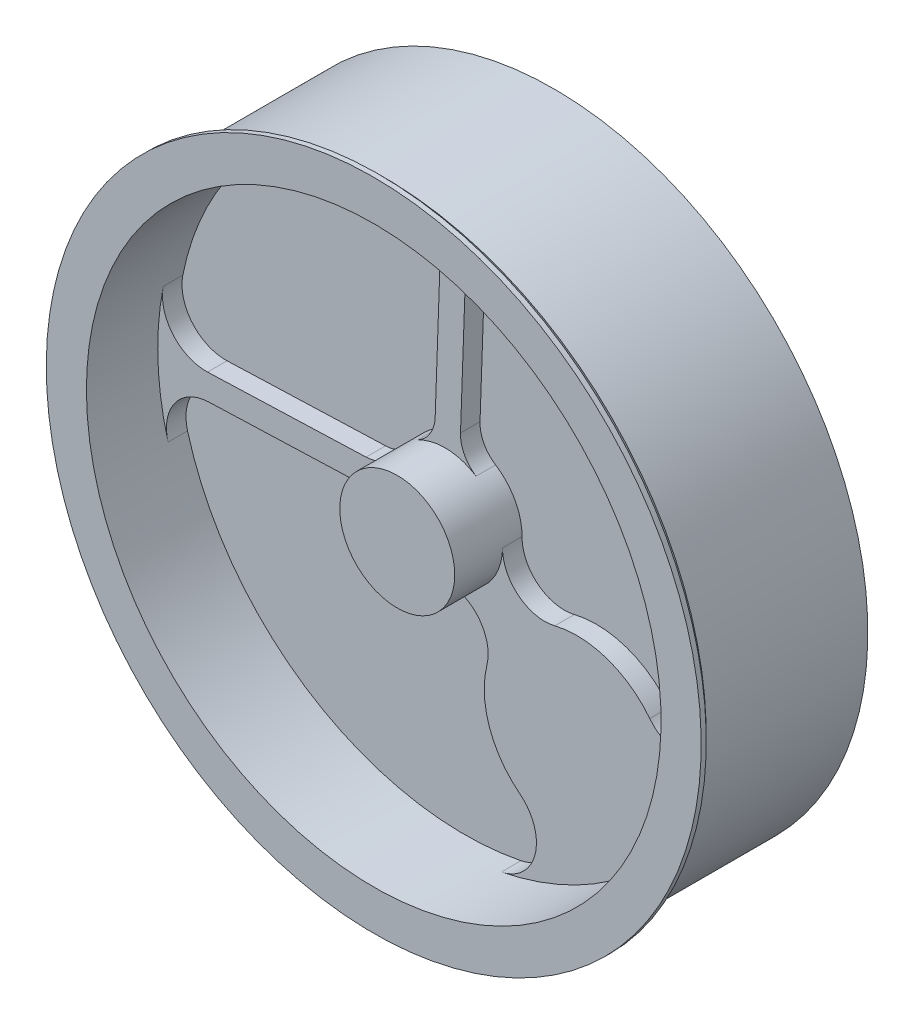
ISO-10303-21;
HEADER;
FILE_DESCRIPTION(('STEP AP214'),'2;1');
FILE_NAME('part.step','',(''),(''),'','','');
FILE_SCHEMA(('AUTOMOTIVE_DESIGN { 1 0 10303 214 1 1 1 1 }'));
ENDSEC;
DATA;
#1=APPLICATION_CONTEXT('core data for automotive mechanical design processes');
#2=APPLICATION_PROTOCOL_DEFINITION('international standard','automotive_design',2000,#1);
#3=PRODUCT_CONTEXT('',#1,'mechanical');
#4=PRODUCT('Part','Part','',(#3));
#5=PRODUCT_RELATED_PRODUCT_CATEGORY('part','',(#4));
#6=PRODUCT_DEFINITION_FORMATION('','',#4);
#7=PRODUCT_DEFINITION_CONTEXT('part definition',#1,'design');
#8=PRODUCT_DEFINITION('design','',#6,#7);
#9=PRODUCT_DEFINITION_SHAPE('','',#8);
#10=(LENGTH_UNIT() NAMED_UNIT(*) SI_UNIT(.MILLI.,.METRE.));
#11=(NAMED_UNIT(*) PLANE_ANGLE_UNIT() SI_UNIT($,.RADIAN.));
#12=(NAMED_UNIT(*) SI_UNIT($,.STERADIAN.) SOLID_ANGLE_UNIT());
#13=UNCERTAINTY_MEASURE_WITH_UNIT(LENGTH_MEASURE(1.E-05),#10,'distance_accuracy_value','');
#14=(GEOMETRIC_REPRESENTATION_CONTEXT(3) GLOBAL_UNCERTAINTY_ASSIGNED_CONTEXT((#13)) GLOBAL_UNIT_ASSIGNED_CONTEXT((#10,
#11,#12)) REPRESENTATION_CONTEXT('',''));
#15=CARTESIAN_POINT('',(0.,0.,0.));
#16=DIRECTION('',(0.,0.,1.));
#17=DIRECTION('',(1.,0.,0.));
#18=AXIS2_PLACEMENT_3D('',#15,#16,#17);
#19=CARTESIAN_POINT('',(-11.5492341504829,-7.39890846931906,17.1965997720002));
#20=DIRECTION('',(0.,0.,-1.));
#21=DIRECTION('',(0.707106781186549,-0.707106781186547,0.));
#22=AXIS2_PLACEMENT_3D('',#19,#20,#21);
#23=CYLINDRICAL_SURFACE('',#22,5.08);
#24=CARTESIAN_POINT('',(-11.5492341504829,-7.39890846931906,7.08025000000022));
#25=DIRECTION('',(0.,0.,1.));
#26=DIRECTION('',(0.707106781186549,-0.707106781186547,0.));
#27=AXIS2_PLACEMENT_3D('',#24,#25,#26);
#28=CIRCLE('',#27,5.08);
#29=CARTESIAN_POINT('',(-7.27174002067506,-4.65857199920099,7.08025000000022));
#30=VERTEX_POINT('',#29);
#31=CARTESIAN_POINT('',(-11.7292502806064,-2.32209901919241,7.08025000000022));
#32=VERTEX_POINT('',#31);
#33=EDGE_CURVE('E522',#30,#32,#28,.T.);
#34=ORIENTED_EDGE('',*,*,#33,.F.);
#35=DIRECTION('',(0.,0.,-1.));
#36=VECTOR('',#35,1.);
#37=CARTESIAN_POINT('',(-7.27174002067506,-4.65857199920099,17.1965997720002));
#38=LINE('',#37,#36);
#39=CARTESIAN_POINT('',(-7.27174002067506,-4.65857199920099,10.0125100000002));
#40=VERTEX_POINT('',#39);
#41=EDGE_CURVE('E386',#40,#30,#38,.T.);
#42=ORIENTED_EDGE('',*,*,#41,.F.);
#43=CARTESIAN_POINT('',(-11.5492341504829,-7.39890846931906,10.0125100000002));
#44=DIRECTION('',(0.,0.,-1.));
#45=DIRECTION('',(0.707106781186549,-0.707106781186547,0.));
#46=AXIS2_PLACEMENT_3D('',#43,#44,#45);
#47=CIRCLE('',#46,5.08);
#48=CARTESIAN_POINT('',(-11.7292502806064,-2.32209901919241,10.0125100000002));
#49=VERTEX_POINT('',#48);
#50=EDGE_CURVE('E250',#49,#40,#47,.T.);
#51=ORIENTED_EDGE('',*,*,#50,.F.);
#52=DIRECTION('',(0.,0.,1.));
#53=VECTOR('',#52,1.);
#54=CARTESIAN_POINT('',(-11.7292502806064,-2.32209901919241,10.0125100000002));
#55=LINE('',#54,#53);
#56=EDGE_CURVE('E546',#32,#49,#55,.T.);
#57=ORIENTED_EDGE('',*,*,#56,.F.);
#58=EDGE_LOOP('',(#34,#42,#51,#57));
#59=FACE_BOUND('',#58,.T.);
#60=ADVANCED_FACE('F17',(#59),#23,.F.);
#61=CARTESIAN_POINT('',(7.3989084693171,11.549234150481,17.1965997720002));
#62=DIRECTION('',(0.,0.,-1.));
#63=DIRECTION('',(0.707106781186549,-0.707106781186547,0.));
#64=AXIS2_PLACEMENT_3D('',#61,#62,#63);
#65=CYLINDRICAL_SURFACE('',#64,5.08);
#66=CARTESIAN_POINT('',(7.3989084693171,11.549234150481,7.08025000000022));
#67=DIRECTION('',(0.,0.,1.));
#68=DIRECTION('',(0.707106781186548,-0.707106781186548,0.));
#69=AXIS2_PLACEMENT_3D('',#66,#67,#68);
#70=CIRCLE('',#69,5.08);
#71=CARTESIAN_POINT('',(2.32209901919045,11.7292502806045,7.08025000000022));
#72=VERTEX_POINT('',#71);
#73=CARTESIAN_POINT('',(4.65857199919904,7.27174002067314,7.08025000000022));
#74=VERTEX_POINT('',#73);
#75=EDGE_CURVE('E505',#72,#74,#70,.T.);
#76=ORIENTED_EDGE('',*,*,#75,.F.);
#77=DIRECTION('',(0.,0.,-1.));
#78=VECTOR('',#77,1.);
#79=CARTESIAN_POINT('',(2.32209901919044,11.7292502806045,7.08025000000022));
#80=LINE('',#79,#78);
#81=CARTESIAN_POINT('',(2.32209901919045,11.7292502806045,10.0125100000002));
#82=VERTEX_POINT('',#81);
#83=EDGE_CURVE('E328',#82,#72,#80,.T.);
#84=ORIENTED_EDGE('',*,*,#83,.F.);
#85=CARTESIAN_POINT('',(7.3989084693171,11.549234150481,10.0125100000002));
#86=DIRECTION('',(0.,0.,-1.));
#87=DIRECTION('',(0.707106781186549,-0.707106781186547,0.));
#88=AXIS2_PLACEMENT_3D('',#85,#86,#87);
#89=CIRCLE('',#88,5.08);
#90=CARTESIAN_POINT('',(4.65857199919904,7.27174002067314,10.0125100000002));
#91=VERTEX_POINT('',#90);
#92=EDGE_CURVE('E397',#91,#82,#89,.T.);
#93=ORIENTED_EDGE('',*,*,#92,.F.);
#94=DIRECTION('',(0.,0.,1.));
#95=VECTOR('',#94,1.);
#96=CARTESIAN_POINT('',(4.65857199919904,7.27174002067314,17.1965997720002));
#97=LINE('',#96,#95);
#98=EDGE_CURVE('E425',#74,#91,#97,.T.);
#99=ORIENTED_EDGE('',*,*,#98,.F.);
#100=EDGE_LOOP('',(#76,#84,#93,#99));
#101=FACE_BOUND('',#100,.T.);
#102=ADVANCED_FACE('F851',(#101),#65,.F.);
#103=CARTESIAN_POINT('',(-8.48548533625716,1.60531448887507,-67.4343168572308));
#104=DIRECTION('',(0.0354362460873041,-0.999371939001311,0.));
#105=DIRECTION('',(0.999371939001311,0.0354362460873041,0.));
#106=AXIS2_PLACEMENT_3D('',#103,#104,#105);
#107=PLANE('',#106);
#108=DIRECTION('',(0.999371939001311,0.0354362460873041,0.));
#109=VECTOR('',#108,1.);
#110=CARTESIAN_POINT('',(-8.48548533625716,1.60531448887507,10.0125100000002));
#111=LINE('',#110,#109);
#112=CARTESIAN_POINT('',(-35.6890021533703,0.640718147162003,10.0125100000002));
#113=VERTEX_POINT('',#112);
#114=CARTESIAN_POINT('',(-11.8642623781991,1.48550806840259,10.0125100000002));
#115=VERTEX_POINT('',#114);
#116=EDGE_CURVE('E214',#113,#115,#111,.T.);
#117=ORIENTED_EDGE('',*,*,#116,.T.);
#118=DIRECTION('',(0.,0.,-1.));
#119=VECTOR('',#118,1.);
#120=CARTESIAN_POINT('',(-11.8642623781991,1.48550806840259,7.08025000000022));
#121=LINE('',#120,#119);
#122=CARTESIAN_POINT('',(-11.8642623781991,1.48550806840259,7.08025000000022));
#123=VERTEX_POINT('',#122);
#124=EDGE_CURVE('E362',#115,#123,#121,.T.);
#125=ORIENTED_EDGE('',*,*,#124,.T.);
#126=DIRECTION('',(0.999371939001311,0.0354362460873041,0.));
#127=VECTOR('',#126,1.);
#128=CARTESIAN_POINT('',(-8.48548533625716,1.60531448887507,7.08025000000022));
#129=LINE('',#128,#127);
#130=CARTESIAN_POINT('',(-35.6890021533703,0.640718147162003,7.08025000000022));
#131=VERTEX_POINT('',#130);
#132=EDGE_CURVE('E206',#131,#123,#129,.T.);
#133=ORIENTED_EDGE('',*,*,#132,.F.);
#134=DIRECTION('',(0.,0.,1.));
#135=VECTOR('',#134,1.);
#136=CARTESIAN_POINT('',(-35.6890021533703,0.640718147162003,-67.4343168572308));
#137=LINE('',#136,#135);
#138=EDGE_CURVE('E11',#131,#113,#137,.T.);
#139=ORIENTED_EDGE('',*,*,#138,.T.);
#140=EDGE_LOOP('',(#117,#125,#133,#139));
#141=FACE_BOUND('',#140,.T.);
#142=ADVANCED_FACE('F885',(#141),#107,.F.);
#143=CARTESIAN_POINT('',(-35.9210244842783,7.18420489685501,-67.4343168572308));
#144=DIRECTION('',(0.,0.,1.));
#145=DIRECTION('',(-0.707106781186549,0.707106781186547,0.));
#146=AXIS2_PLACEMENT_3D('',#143,#144,#145);
#147=CYLINDRICAL_SURFACE('',#146,6.54759904128587);
#148=DIRECTION('',(0.,0.,1.));
#149=VECTOR('',#148,1.);
#150=CARTESIAN_POINT('',(-42.3414735763357,8.46829471526647,-67.4343168572308));
#151=LINE('',#150,#149);
#152=CARTESIAN_POINT('',(-42.3414735763357,8.46829471526647,7.08025000000022));
#153=VERTEX_POINT('',#152);
#154=CARTESIAN_POINT('',(-42.3414735763357,8.46829471526647,10.0125100000002));
#155=VERTEX_POINT('',#154);
#156=EDGE_CURVE('E74',#153,#155,#151,.T.);
#157=ORIENTED_EDGE('',*,*,#156,.T.);
#158=CARTESIAN_POINT('',(-35.9210244842783,7.18420489685501,10.0125100000002));
#159=DIRECTION('',(0.,0.,1.));
#160=DIRECTION('',(-0.707106781186549,0.707106781186547,0.));
#161=AXIS2_PLACEMENT_3D('',#158,#159,#160);
#162=CIRCLE('',#161,6.54759904128587);
#163=EDGE_CURVE('E481',#155,#113,#162,.T.);
#164=ORIENTED_EDGE('',*,*,#163,.T.);
#165=ORIENTED_EDGE('',*,*,#138,.F.);
#166=CARTESIAN_POINT('',(-35.9210244842783,7.18420489685501,7.08025000000022));
#167=DIRECTION('',(0.,0.,1.));
#168=DIRECTION('',(0.707106781186551,-0.707106781186544,0.));
#169=AXIS2_PLACEMENT_3D('',#166,#167,#168);
#170=CIRCLE('',#169,6.54759904128587);
#171=EDGE_CURVE('E474',#153,#131,#170,.T.);
#172=ORIENTED_EDGE('',*,*,#171,.F.);
#173=EDGE_LOOP('',(#157,#164,#165,#172));
#174=FACE_BOUND('',#173,.T.);
#175=ADVANCED_FACE('F769',(#174),#147,.F.);
#176=CARTESIAN_POINT('',(-7.18420489685705,35.9210244842764,-67.4343168572308));
#177=DIRECTION('',(0.,0.,1.));
#178=DIRECTION('',(-0.707106781186549,0.707106781186547,0.));
#179=AXIS2_PLACEMENT_3D('',#176,#177,#178);
#180=CYLINDRICAL_SURFACE('',#179,6.54759904128587);
#181=DIRECTION('',(0.,0.,1.));
#182=VECTOR('',#181,1.);
#183=CARTESIAN_POINT('',(-0.640718147164029,35.6890021533683,-67.4343168572308));
#184=LINE('',#183,#182);
#185=CARTESIAN_POINT('',(-0.640718147164029,35.6890021533683,7.08025000000022));
#186=VERTEX_POINT('',#185);
#187=CARTESIAN_POINT('',(-0.640718147164029,35.6890021533683,10.0125100000002));
#188=VERTEX_POINT('',#187);
#189=EDGE_CURVE('E27',#186,#188,#184,.T.);
#190=ORIENTED_EDGE('',*,*,#189,.T.);
#191=CARTESIAN_POINT('',(-7.18420489685705,35.9210244842764,10.0125100000002));
#192=DIRECTION('',(0.,0.,1.));
#193=DIRECTION('',(-0.707106781186549,0.707106781186547,0.));
#194=AXIS2_PLACEMENT_3D('',#191,#192,#193);
#195=CIRCLE('',#194,6.54759904128587);
#196=CARTESIAN_POINT('',(-8.46829471526851,42.3414735763337,10.0125100000002));
#197=VERTEX_POINT('',#196);
#198=EDGE_CURVE('E453',#188,#197,#195,.T.);
#199=ORIENTED_EDGE('',*,*,#198,.T.);
#200=DIRECTION('',(0.,0.,1.));
#201=VECTOR('',#200,1.);
#202=CARTESIAN_POINT('',(-8.46829471526851,42.3414735763337,-67.4343168572308));
#203=LINE('',#202,#201);
#204=CARTESIAN_POINT('',(-8.46829471526851,42.3414735763337,7.08025000000022));
#205=VERTEX_POINT('',#204);
#206=EDGE_CURVE('E353',#205,#197,#203,.T.);
#207=ORIENTED_EDGE('',*,*,#206,.F.);
#208=CARTESIAN_POINT('',(-7.18420489685705,35.9210244842764,7.08025000000022));
#209=DIRECTION('',(0.,0.,1.));
#210=DIRECTION('',(0.707106781186549,-0.707106781186547,0.));
#211=AXIS2_PLACEMENT_3D('',#208,#209,#210);
#212=CIRCLE('',#211,6.54759904128587);
#213=EDGE_CURVE('E447',#186,#205,#212,.T.);
#214=ORIENTED_EDGE('',*,*,#213,.F.);
#215=EDGE_LOOP('',(#190,#199,#207,#214));
#216=FACE_BOUND('',#215,.T.);
#217=ADVANCED_FACE('F858',(#216),#180,.F.);
#218=CARTESIAN_POINT('',(-0.640718147164029,35.6890021533683,-67.4343168572308));
#219=DIRECTION('',(0.999371939001312,-0.0354362460873013,0.));
#220=DIRECTION('',(0.0354362460873013,0.999371939001312,0.));
#221=AXIS2_PLACEMENT_3D('',#218,#219,#220);
#222=PLANE('',#221);
#223=DIRECTION('',(0.0354362460873013,0.999371939001312,0.));
#224=VECTOR('',#223,1.);
#225=CARTESIAN_POINT('',(-0.640718147164029,35.6890021533683,7.08025000000022));
#226=LINE('',#225,#224);
#227=CARTESIAN_POINT('',(-1.48550806840454,11.8642623781971,7.08025000000022));
#228=VERTEX_POINT('',#227);
#229=EDGE_CURVE('E314',#228,#186,#226,.T.);
#230=ORIENTED_EDGE('',*,*,#229,.F.);
#231=DIRECTION('',(0.,0.,1.));
#232=VECTOR('',#231,1.);
#233=CARTESIAN_POINT('',(-1.48550806840454,11.8642623781971,10.0125100000002));
#234=LINE('',#233,#232);
#235=CARTESIAN_POINT('',(-1.48550806840454,11.8642623781971,10.0125100000002));
#236=VERTEX_POINT('',#235);
#237=EDGE_CURVE('E458',#228,#236,#234,.T.);
#238=ORIENTED_EDGE('',*,*,#237,.T.);
#239=DIRECTION('',(0.0354362460873013,0.999371939001312,0.));
#240=VECTOR('',#239,1.);
#241=CARTESIAN_POINT('',(-0.640718147164029,35.6890021533683,10.0125100000002));
#242=LINE('',#241,#240);
#243=EDGE_CURVE('E450',#236,#188,#242,.T.);
#244=ORIENTED_EDGE('',*,*,#243,.T.);
#245=ORIENTED_EDGE('',*,*,#189,.F.);
#246=EDGE_LOOP('',(#230,#238,#244,#245));
#247=FACE_BOUND('',#246,.T.);
#248=ADVANCED_FACE('F855',(#247),#222,.F.);
#249=CARTESIAN_POINT('',(-1.66533453693774E-12,-2.63677968348475E-13,7.08025000000022));
#250=DIRECTION('',(0.,0.,-1.));
#251=DIRECTION('',(0.453990499739542,0.891006524188371,0.));
#252=AXIS2_PLACEMENT_3D('',#249,#250,#251);
#253=PLANE('',#252);
#254=CARTESIAN_POINT('',(-1.66533453693774E-12,-2.63677968348475E-13,7.08025000000022));
#255=DIRECTION('',(0.,0.,-1.));
#256=DIRECTION('',(0.707106781186549,-0.707106781186547,0.));
#257=AXIS2_PLACEMENT_3D('',#254,#255,#256);
#258=CIRCLE('',#257,8.636);
#259=CARTESIAN_POINT('',(-7.58343461635186,4.1318295487035,7.08025000000022));
#260=VERTEX_POINT('',#259);
#261=CARTESIAN_POINT('',(-4.13182954870546,7.58343461634993,7.08025000000022));
#262=VERTEX_POINT('',#261);
#263=EDGE_CURVE('E340',#260,#262,#258,.T.);
#264=ORIENTED_EDGE('',*,*,#263,.T.);
#265=CARTESIAN_POINT('',(-6.56231751853122,12.0442785083206,7.08025000000022));
#266=DIRECTION('',(0.,0.,1.));
#267=DIRECTION('',(0.707106781186555,-0.70710678118654,0.));
#268=AXIS2_PLACEMENT_3D('',#265,#266,#267);
#269=CIRCLE('',#268,5.08);
#270=EDGE_CURVE('E361',#262,#228,#269,.T.);
#271=ORIENTED_EDGE('',*,*,#270,.T.);
#272=ORIENTED_EDGE('',*,*,#229,.T.);
#273=ORIENTED_EDGE('',*,*,#213,.T.);
#274=CARTESIAN_POINT('',(-1.66533453693774E-12,-2.63677968348475E-13,7.08025000000022));
#275=DIRECTION('',(0.,0.,1.));
#276=DIRECTION('',(0.707106781186548,-0.707106781186548,0.));
#277=AXIS2_PLACEMENT_3D('',#274,#275,#276);
#278=CIRCLE('',#277,43.18);
#279=EDGE_CURVE('E469',#205,#153,#278,.T.);
#280=ORIENTED_EDGE('',*,*,#279,.T.);
#281=ORIENTED_EDGE('',*,*,#171,.T.);
#282=ORIENTED_EDGE('',*,*,#132,.T.);
#283=CARTESIAN_POINT('',(-12.0442785083226,6.56231751852925,7.08025000000022));
#284=DIRECTION('',(0.,0.,1.));
#285=DIRECTION('',(0.707106781186547,-0.707106781186549,0.));
#286=AXIS2_PLACEMENT_3D('',#283,#284,#285);
#287=CIRCLE('',#286,5.08);
#288=EDGE_CURVE('E439',#123,#260,#287,.T.);
#289=ORIENTED_EDGE('',*,*,#288,.T.);
#290=EDGE_LOOP('',(#264,#271,#272,#273,#280,#281,#282,#289));
#291=FACE_BOUND('',#290,.T.);
#292=ADVANCED_FACE('F563',(#291),#253,.F.);
#293=CARTESIAN_POINT('',(35.921024484275,-7.18420489685553,-67.4343168572308));
#294=DIRECTION('',(0.,0.,1.));
#295=DIRECTION('',(-0.707106781186549,0.707106781186547,0.));
#296=AXIS2_PLACEMENT_3D('',#293,#294,#295);
#297=CYLINDRICAL_SURFACE('',#296,6.54759904128587);
#298=DIRECTION('',(0.,0.,1.));
#299=VECTOR('',#298,1.);
#300=CARTESIAN_POINT('',(30.7675471524146,-11.2231063063292,-67.4343168572308));
#301=LINE('',#300,#299);
#302=CARTESIAN_POINT('',(30.7675471524146,-11.2231063063292,7.08025000000022));
#303=VERTEX_POINT('',#302);
#304=CARTESIAN_POINT('',(30.7675471524146,-11.2231063063292,10.0125100000002));
#305=VERTEX_POINT('',#304);
#306=EDGE_CURVE('E310',#303,#305,#301,.T.);
#307=ORIENTED_EDGE('',*,*,#306,.T.);
#308=CARTESIAN_POINT('',(35.921024484275,-7.18420489685553,10.0125100000002));
#309=DIRECTION('',(0.,0.,1.));
#310=DIRECTION('',(0.707106781186549,-0.707106781186547,0.));
#311=AXIS2_PLACEMENT_3D('',#308,#309,#310);
#312=CIRCLE('',#311,6.54759904128587);
#313=CARTESIAN_POINT('',(42.3414735763323,-8.468294715267,10.0125100000002));
#314=VERTEX_POINT('',#313);
#315=EDGE_CURVE('E258',#305,#314,#312,.T.);
#316=ORIENTED_EDGE('',*,*,#315,.T.);
#317=DIRECTION('',(0.,0.,1.));
#318=VECTOR('',#317,1.);
#319=CARTESIAN_POINT('',(42.3414735763323,-8.468294715267,-67.4343168572308));
#320=LINE('',#319,#318);
#321=CARTESIAN_POINT('',(42.3414735763323,-8.468294715267,7.08025000000022));
#322=VERTEX_POINT('',#321);
#323=EDGE_CURVE('E232',#322,#314,#320,.T.);
#324=ORIENTED_EDGE('',*,*,#323,.F.);
#325=CARTESIAN_POINT('',(35.921024484275,-7.18420489685553,7.08025000000022));
#326=DIRECTION('',(0.,0.,1.));
#327=DIRECTION('',(0.707106781186549,-0.707106781186547,0.));
#328=AXIS2_PLACEMENT_3D('',#325,#326,#327);
#329=CIRCLE('',#328,6.54759904128587);
#330=EDGE_CURVE('E306',#303,#322,#329,.T.);
#331=ORIENTED_EDGE('',*,*,#330,.F.);
#332=EDGE_LOOP('',(#307,#316,#324,#331));
#333=FACE_BOUND('',#332,.T.);
#334=ADVANCED_FACE('F865',(#333),#297,.F.);
#335=CARTESIAN_POINT('',(19.8104450030769,-19.8104450030788,-67.4343168572308));
#336=DIRECTION('',(0.,0.,1.));
#337=DIRECTION('',(-0.707106781186549,0.707106781186547,0.));
#338=AXIS2_PLACEMENT_3D('',#335,#336,#337);
#339=CYLINDRICAL_SURFACE('',#338,13.921223847195);
#340=DIRECTION('',(0.,0.,1.));
#341=VECTOR('',#340,1.);
#342=CARTESIAN_POINT('',(16.4969267460492,-6.28931079902417,-67.4343168572308));
#343=LINE('',#342,#341);
#344=CARTESIAN_POINT('',(16.4969267460492,-6.28931079902417,7.08025000000022));
#345=VERTEX_POINT('',#344);
#346=CARTESIAN_POINT('',(16.4969267460492,-6.28931079902417,10.0125100000002));
#347=VERTEX_POINT('',#346);
#348=EDGE_CURVE('E315',#345,#347,#343,.T.);
#349=ORIENTED_EDGE('',*,*,#348,.T.);
#350=CARTESIAN_POINT('',(19.8104450030769,-19.8104450030788,10.0125100000002));
#351=DIRECTION('',(0.,0.,-1.));
#352=DIRECTION('',(-0.707106781186549,0.707106781186547,0.));
#353=AXIS2_PLACEMENT_3D('',#350,#351,#352);
#354=CIRCLE('',#353,13.921223847195);
#355=EDGE_CURVE('E295',#347,#305,#354,.T.);
#356=ORIENTED_EDGE('',*,*,#355,.T.);
#357=ORIENTED_EDGE('',*,*,#306,.F.);
#358=CARTESIAN_POINT('',(19.8104450030769,-19.8104450030788,7.08025000000022));
#359=DIRECTION('',(0.,0.,-1.));
#360=DIRECTION('',(0.707106781186549,-0.707106781186547,0.));
#361=AXIS2_PLACEMENT_3D('',#358,#359,#360);
#362=CIRCLE('',#361,13.921223847195);
#363=EDGE_CURVE('E303',#345,#303,#362,.T.);
#364=ORIENTED_EDGE('',*,*,#363,.F.);
#365=EDGE_LOOP('',(#349,#356,#357,#364));
#366=FACE_BOUND('',#365,.T.);
#367=ADVANCED_FACE('F868',(#366),#339,.T.);
#368=CARTESIAN_POINT('',(14.9855049656742,-0.121806911566297,-67.4343168572308));
#369=DIRECTION('',(0.,0.,1.));
#370=DIRECTION('',(-0.707106781186549,0.707106781186547,0.));
#371=AXIS2_PLACEMENT_3D('',#368,#369,#370);
#372=CYLINDRICAL_SURFACE('',#371,6.35);
#373=DIRECTION('',(0.,0.,1.));
#374=VECTOR('',#373,1.);
#375=CARTESIAN_POINT('',(8.63571472598101,-0.0701938134450852,-67.4343168572308));
#376=LINE('',#375,#374);
#377=CARTESIAN_POINT('',(8.63571472598101,-0.0701938134450852,7.08025000000022));
#378=VERTEX_POINT('',#377);
#379=CARTESIAN_POINT('',(8.63571472598101,-0.0701938134450852,10.0125100000002));
#380=VERTEX_POINT('',#379);
#381=EDGE_CURVE('E426',#378,#380,#376,.T.);
#382=ORIENTED_EDGE('',*,*,#381,.T.);
#383=CARTESIAN_POINT('',(14.9855049656742,-0.121806911566297,10.0125100000002));
#384=DIRECTION('',(0.,0.,1.));
#385=DIRECTION('',(0.707106781186549,-0.707106781186547,0.));
#386=AXIS2_PLACEMENT_3D('',#383,#384,#385);
#387=CIRCLE('',#386,6.35);
#388=EDGE_CURVE('E300',#380,#347,#387,.T.);
#389=ORIENTED_EDGE('',*,*,#388,.T.);
#390=ORIENTED_EDGE('',*,*,#348,.F.);
#391=CARTESIAN_POINT('',(14.9855049656742,-0.121806911566297,7.08025000000022));
#392=DIRECTION('',(0.,0.,1.));
#393=DIRECTION('',(0.707106781186549,-0.707106781186546,0.));
#394=AXIS2_PLACEMENT_3D('',#391,#392,#393);
#395=CIRCLE('',#394,6.35);
#396=EDGE_CURVE('E307',#378,#345,#395,.T.);
#397=ORIENTED_EDGE('',*,*,#396,.F.);
#398=EDGE_LOOP('',(#382,#389,#390,#397));
#399=FACE_BOUND('',#398,.T.);
#400=ADVANCED_FACE('F841',(#399),#372,.F.);
#401=CARTESIAN_POINT('',(3.16688894043096,35.5539900557758,-67.4343168572308));
#402=DIRECTION('',(-0.999371939001311,0.035436246087302,0.));
#403=DIRECTION('',(-0.035436246087302,-0.999371939001311,0.));
#404=AXIS2_PLACEMENT_3D('',#401,#402,#403);
#405=PLANE('',#404);
#406=DIRECTION('',(-0.035436246087302,-0.999371939001311,0.));
#407=VECTOR('',#406,1.);
#408=CARTESIAN_POINT('',(3.16688894043096,35.5539900557758,10.0125100000002));
#409=LINE('',#408,#407);
#410=CARTESIAN_POINT('',(3.16688894043096,35.5539900557758,10.0125100000002));
#411=VERTEX_POINT('',#410);
#412=EDGE_CURVE('E464',#411,#82,#409,.T.);
#413=ORIENTED_EDGE('',*,*,#412,.T.);
#414=ORIENTED_EDGE('',*,*,#83,.T.);
#415=DIRECTION('',(-0.035436246087302,-0.999371939001311,0.));
#416=VECTOR('',#415,1.);
#417=CARTESIAN_POINT('',(3.16688894043096,35.5539900557758,7.08025000000022));
#418=LINE('',#417,#416);
#419=CARTESIAN_POINT('',(3.16688894043096,35.5539900557758,7.08025000000022));
#420=VERTEX_POINT('',#419);
#421=EDGE_CURVE('E508',#420,#72,#418,.T.);
#422=ORIENTED_EDGE('',*,*,#421,.F.);
#423=DIRECTION('',(0.,0.,1.));
#424=VECTOR('',#423,1.);
#425=CARTESIAN_POINT('',(3.16688894043096,35.5539900557758,-67.4343168572308));
#426=LINE('',#425,#424);
#427=EDGE_CURVE('E347',#420,#411,#426,.T.);
#428=ORIENTED_EDGE('',*,*,#427,.T.);
#429=EDGE_LOOP('',(#413,#414,#422,#428));
#430=FACE_BOUND('',#429,.T.);
#431=ADVANCED_FACE('F876',(#430),#405,.F.);
#432=ORIENTED_EDGE('',*,*,#421,.T.);
#433=ORIENTED_EDGE('',*,*,#75,.T.);
#434=EDGE_CURVE('E420',#74,#378,#258,.T.);
#435=ORIENTED_EDGE('',*,*,#434,.T.);
#436=ORIENTED_EDGE('',*,*,#396,.T.);
#437=ORIENTED_EDGE('',*,*,#363,.T.);
#438=ORIENTED_EDGE('',*,*,#330,.T.);
#439=CARTESIAN_POINT('',(-1.66533453693774E-12,-2.63677968348475E-13,7.08025000000022));
#440=DIRECTION('',(0.,0.,1.));
#441=DIRECTION('',(0.707106781186549,-0.707106781186547,0.));
#442=AXIS2_PLACEMENT_3D('',#439,#440,#441);
#443=CIRCLE('',#442,43.18);
#444=CARTESIAN_POINT('',(11.4459880140568,41.6353426595965,7.08025000000022));
#445=VERTEX_POINT('',#444);
#446=EDGE_CURVE('E323',#322,#445,#443,.T.);
#447=ORIENTED_EDGE('',*,*,#446,.T.);
#448=CARTESIAN_POINT('',(9.71037569012394,35.3219677248678,7.08025000000022));
#449=DIRECTION('',(0.,0.,1.));
#450=DIRECTION('',(0.70710678118655,-0.707106781186545,0.));
#451=AXIS2_PLACEMENT_3D('',#448,#449,#450);
#452=CIRCLE('',#451,6.54759904128587);
#453=EDGE_CURVE('E348',#445,#420,#452,.T.);
#454=ORIENTED_EDGE('',*,*,#453,.T.);
#455=EDGE_LOOP('',(#432,#433,#435,#436,#437,#438,#447,#454));
#456=FACE_BOUND('',#455,.T.);
#457=ADVANCED_FACE('F846',(#456),#253,.F.);
#458=CARTESIAN_POINT('',(-8.35047323866453,-2.20229259871993,-67.4343168572308));
#459=DIRECTION('',(-0.0354362460873041,0.999371939001311,0.));
#460=DIRECTION('',(-0.999371939001311,-0.0354362460873041,0.));
#461=AXIS2_PLACEMENT_3D('',#458,#459,#460);
#462=PLANE('',#461);
#463=DIRECTION('',(-0.999371939001311,-0.0354362460873041,0.));
#464=VECTOR('',#463,1.);
#465=CARTESIAN_POINT('',(-8.35047323866453,-2.20229259871993,7.08025000000022));
#466=LINE('',#465,#464);
#467=CARTESIAN_POINT('',(-35.5539900557777,-3.16688894043299,7.08025000000022));
#468=VERTEX_POINT('',#467);
#469=EDGE_CURVE('E279',#32,#468,#466,.T.);
#470=ORIENTED_EDGE('',*,*,#469,.F.);
#471=ORIENTED_EDGE('',*,*,#56,.T.);
#472=DIRECTION('',(-0.999371939001311,-0.0354362460873041,0.));
#473=VECTOR('',#472,1.);
#474=CARTESIAN_POINT('',(-8.35047323866453,-2.20229259871993,10.0125100000002));
#475=LINE('',#474,#473);
#476=CARTESIAN_POINT('',(-35.5539900557777,-3.16688894043299,10.0125100000002));
#477=VERTEX_POINT('',#476);
#478=EDGE_CURVE('E543',#49,#477,#475,.T.);
#479=ORIENTED_EDGE('',*,*,#478,.T.);
#480=DIRECTION('',(0.,0.,1.));
#481=VECTOR('',#480,1.);
#482=CARTESIAN_POINT('',(-35.5539900557777,-3.16688894043299,-67.4343168572308));
#483=LINE('',#482,#481);
#484=EDGE_CURVE('E549',#468,#477,#483,.T.);
#485=ORIENTED_EDGE('',*,*,#484,.F.);
#486=EDGE_LOOP('',(#470,#471,#479,#485));
#487=FACE_BOUND('',#486,.T.);
#488=ADVANCED_FACE('F803',(#487),#462,.F.);
#489=CARTESIAN_POINT('',(0.121806911564409,-14.9855049656761,-67.4343168572308));
#490=DIRECTION('',(0.,0.,1.));
#491=DIRECTION('',(-0.707106781186549,0.707106781186547,0.));
#492=AXIS2_PLACEMENT_3D('',#489,#490,#491);
#493=CYLINDRICAL_SURFACE('',#492,6.35);
#494=DIRECTION('',(0.,0.,1.));
#495=VECTOR('',#494,1.);
#496=CARTESIAN_POINT('',(6.28931079902229,-16.496926746051,-67.4343168572308));
#497=LINE('',#496,#495);
#498=CARTESIAN_POINT('',(6.28931079902229,-16.496926746051,7.08025000000022));
#499=VERTEX_POINT('',#498);
#500=CARTESIAN_POINT('',(6.28931079902229,-16.496926746051,10.0125100000002));
#501=VERTEX_POINT('',#500);
#502=EDGE_CURVE('E285',#499,#501,#497,.T.);
#503=ORIENTED_EDGE('',*,*,#502,.T.);
#504=CARTESIAN_POINT('',(0.121806911564409,-14.9855049656761,10.0125100000002));
#505=DIRECTION('',(0.,0.,1.));
#506=DIRECTION('',(-0.707106781186549,0.707106781186547,0.));
#507=AXIS2_PLACEMENT_3D('',#504,#505,#506);
#508=CIRCLE('',#507,6.35);
#509=CARTESIAN_POINT('',(0.070193813443184,-8.63571472598294,10.0125100000002));
#510=VERTEX_POINT('',#509);
#511=EDGE_CURVE('E269',#501,#510,#508,.T.);
#512=ORIENTED_EDGE('',*,*,#511,.T.);
#513=DIRECTION('',(0.,0.,1.));
#514=VECTOR('',#513,1.);
#515=CARTESIAN_POINT('',(0.070193813443184,-8.63571472598294,-67.4343168572308));
#516=LINE('',#515,#514);
#517=CARTESIAN_POINT('',(0.070193813443184,-8.63571472598294,7.08025000000022));
#518=VERTEX_POINT('',#517);
#519=EDGE_CURVE('E412',#518,#510,#516,.T.);
#520=ORIENTED_EDGE('',*,*,#519,.F.);
#521=CARTESIAN_POINT('',(0.121806911564409,-14.9855049656761,7.08025000000022));
#522=DIRECTION('',(0.,0.,1.));
#523=DIRECTION('',(0.707106781186549,-0.707106781186547,0.));
#524=AXIS2_PLACEMENT_3D('',#521,#522,#523);
#525=CIRCLE('',#524,6.35);
#526=EDGE_CURVE('E286',#499,#518,#525,.T.);
#527=ORIENTED_EDGE('',*,*,#526,.F.);
#528=EDGE_LOOP('',(#503,#512,#520,#527));
#529=FACE_BOUND('',#528,.T.);
#530=ADVANCED_FACE('F834',(#529),#493,.F.);
#531=DIRECTION('',(0.,0.,1.));
#532=VECTOR('',#531,1.);
#533=CARTESIAN_POINT('',(11.2231063063274,-30.7675471524165,-67.4343168572308));
#534=LINE('',#533,#532);
#535=CARTESIAN_POINT('',(11.2231063063274,-30.7675471524165,7.08025000000022));
#536=VERTEX_POINT('',#535);
#537=CARTESIAN_POINT('',(11.2231063063274,-30.7675471524165,10.0125100000002));
#538=VERTEX_POINT('',#537);
#539=EDGE_CURVE('E282',#536,#538,#534,.T.);
#540=ORIENTED_EDGE('',*,*,#539,.T.);
#541=EDGE_CURVE('E256',#538,#501,#354,.T.);
#542=ORIENTED_EDGE('',*,*,#541,.T.);
#543=ORIENTED_EDGE('',*,*,#502,.F.);
#544=EDGE_CURVE('E278',#536,#499,#362,.T.);
#545=ORIENTED_EDGE('',*,*,#544,.F.);
#546=EDGE_LOOP('',(#540,#542,#543,#545));
#547=FACE_BOUND('',#546,.T.);
#548=ADVANCED_FACE('F871',(#547),#339,.T.);
#549=CARTESIAN_POINT('',(7.18420489685371,-35.9210244842769,-67.4343168572308));
#550=DIRECTION('',(0.,0.,1.));
#551=DIRECTION('',(-0.707106781186549,0.707106781186547,0.));
#552=AXIS2_PLACEMENT_3D('',#549,#550,#551);
#553=CYLINDRICAL_SURFACE('',#552,6.54759904128587);
#554=DIRECTION('',(0.,0.,1.));
#555=VECTOR('',#554,1.);
#556=CARTESIAN_POINT('',(8.46829471526518,-42.3414735763342,-67.4343168572308));
#557=LINE('',#556,#555);
#558=CARTESIAN_POINT('',(8.46829471526518,-42.3414735763342,7.08025000000022));
#559=VERTEX_POINT('',#558);
#560=CARTESIAN_POINT('',(8.46829471526518,-42.3414735763342,10.0125100000002));
#561=VERTEX_POINT('',#560);
#562=EDGE_CURVE('E229',#559,#561,#557,.T.);
#563=ORIENTED_EDGE('',*,*,#562,.T.);
#564=CARTESIAN_POINT('',(7.18420489685371,-35.9210244842769,10.0125100000002));
#565=DIRECTION('',(0.,0.,1.));
#566=DIRECTION('',(-0.707106781186549,0.707106781186547,0.));
#567=AXIS2_PLACEMENT_3D('',#564,#565,#566);
#568=CIRCLE('',#567,6.54759904128587);
#569=EDGE_CURVE('E243',#561,#538,#568,.T.);
#570=ORIENTED_EDGE('',*,*,#569,.T.);
#571=ORIENTED_EDGE('',*,*,#539,.F.);
#572=CARTESIAN_POINT('',(7.18420489685371,-35.9210244842769,7.08025000000022));
#573=DIRECTION('',(0.,0.,1.));
#574=DIRECTION('',(0.707106781186549,-0.707106781186547,0.));
#575=AXIS2_PLACEMENT_3D('',#572,#573,#574);
#576=CIRCLE('',#575,6.54759904128587);
#577=EDGE_CURVE('E246',#559,#536,#576,.T.);
#578=ORIENTED_EDGE('',*,*,#577,.F.);
#579=EDGE_LOOP('',(#563,#570,#571,#578));
#580=FACE_BOUND('',#579,.T.);
#581=ADVANCED_FACE('F242',(#580),#553,.F.);
#582=EDGE_CURVE('E408',#518,#30,#258,.T.);
#583=ORIENTED_EDGE('',*,*,#582,.T.);
#584=ORIENTED_EDGE('',*,*,#33,.T.);
#585=ORIENTED_EDGE('',*,*,#469,.T.);
#586=CARTESIAN_POINT('',(-35.3219677248697,-9.71037569012596,7.08025000000022));
#587=DIRECTION('',(0.,0.,1.));
#588=DIRECTION('',(0.707106781186551,-0.707106781186545,0.));
#589=AXIS2_PLACEMENT_3D('',#586,#587,#588);
#590=CIRCLE('',#589,6.54759904128587);
#591=CARTESIAN_POINT('',(-41.6353426595983,-11.4459880140588,7.08025000000022));
#592=VERTEX_POINT('',#591);
#593=EDGE_CURVE('E378',#468,#592,#590,.T.);
#594=ORIENTED_EDGE('',*,*,#593,.T.);
#595=CARTESIAN_POINT('',(-1.66533453693774E-12,-2.63677968348475E-13,7.08025000000022));
#596=DIRECTION('',(0.,0.,1.));
#597=DIRECTION('',(0.70710678118655,-0.707106781186546,0.));
#598=AXIS2_PLACEMENT_3D('',#595,#596,#597);
#599=CIRCLE('',#598,43.18);
#600=EDGE_CURVE('E249',#592,#559,#599,.T.);
#601=ORIENTED_EDGE('',*,*,#600,.T.);
#602=ORIENTED_EDGE('',*,*,#577,.T.);
#603=ORIENTED_EDGE('',*,*,#544,.T.);
#604=ORIENTED_EDGE('',*,*,#526,.T.);
#605=EDGE_LOOP('',(#583,#584,#585,#594,#601,#602,#603,#604));
#606=FACE_BOUND('',#605,.T.);
#607=ADVANCED_FACE('F800',(#606),#253,.F.);
#608=CARTESIAN_POINT('',(-1.66533453693774E-12,-2.63677968348475E-13,17.1965997720002));
#609=DIRECTION('',(0.,0.,1.));
#610=DIRECTION('',(-0.707106781186549,0.707106781186547,0.));
#611=AXIS2_PLACEMENT_3D('',#608,#609,#610);
#612=PLANE('',#611);
#613=CARTESIAN_POINT('',(-1.66533453693774E-12,-2.63677968348475E-13,17.1965997720002));
#614=DIRECTION('',(0.,0.,1.));
#615=DIRECTION('',(-0.707106781186549,0.707106781186547,0.));
#616=AXIS2_PLACEMENT_3D('',#613,#614,#615);
#617=CIRCLE('',#616,8.636);
#618=CARTESIAN_POINT('',(-6.1065741623287,6.10657416232676,17.1965997720002));
#619=VERTEX_POINT('',#618);
#620=EDGE_CURVE('E404',#619,#619,#617,.T.);
#621=ORIENTED_EDGE('',*,*,#620,.T.);
#622=EDGE_LOOP('',(#621));
#623=FACE_BOUND('',#622,.T.);
#624=ADVANCED_FACE('F1002',(#623),#612,.T.);
#625=CARTESIAN_POINT('',(-1.66533453693774E-12,-2.63677968348475E-13,10.0125100000002));
#626=DIRECTION('',(0.,0.,-1.));
#627=DIRECTION('',(0.453990499739542,0.891006524188371,0.));
#628=AXIS2_PLACEMENT_3D('',#625,#626,#627);
#629=PLANE('',#628);
#630=ORIENTED_EDGE('',*,*,#116,.F.);
#631=ORIENTED_EDGE('',*,*,#163,.F.);
#632=CARTESIAN_POINT('',(-1.66533453693774E-12,-2.63677968348475E-13,10.0125100000002));
#633=DIRECTION('',(0.,0.,1.));
#634=DIRECTION('',(0.707106781186546,-0.707106781186549,0.));
#635=AXIS2_PLACEMENT_3D('',#632,#633,#634);
#636=CIRCLE('',#635,43.18);
#637=CARTESIAN_POINT('',(-41.6353426595983,-11.4459880140588,10.0125100000002));
#638=VERTEX_POINT('',#637);
#639=EDGE_CURVE('E484',#155,#638,#636,.T.);
#640=ORIENTED_EDGE('',*,*,#639,.T.);
#641=CARTESIAN_POINT('',(-35.3219677248697,-9.71037569012596,10.0125100000002));
#642=DIRECTION('',(0.,0.,1.));
#643=DIRECTION('',(-0.707106781186549,0.707106781186547,0.));
#644=AXIS2_PLACEMENT_3D('',#641,#642,#643);
#645=CIRCLE('',#644,6.54759904128587);
#646=EDGE_CURVE('E373',#477,#638,#645,.T.);
#647=ORIENTED_EDGE('',*,*,#646,.F.);
#648=ORIENTED_EDGE('',*,*,#478,.F.);
#649=ORIENTED_EDGE('',*,*,#50,.T.);
#650=CARTESIAN_POINT('',(-1.66533453693774E-12,-2.63677968348475E-13,10.0125100000002));
#651=DIRECTION('',(0.,0.,1.));
#652=DIRECTION('',(0.707106781186549,-0.707106781186547,0.));
#653=AXIS2_PLACEMENT_3D('',#650,#651,#652);
#654=CIRCLE('',#653,8.636);
#655=CARTESIAN_POINT('',(-7.58343461635186,4.1318295487035,10.0125100000002));
#656=VERTEX_POINT('',#655);
#657=EDGE_CURVE('E381',#656,#40,#654,.T.);
#658=ORIENTED_EDGE('',*,*,#657,.F.);
#659=CARTESIAN_POINT('',(-12.0442785083226,6.56231751852925,10.0125100000002));
#660=DIRECTION('',(0.,0.,-1.));
#661=DIRECTION('',(0.707106781186549,-0.707106781186547,0.));
#662=AXIS2_PLACEMENT_3D('',#659,#660,#661);
#663=CIRCLE('',#662,5.08);
#664=EDGE_CURVE('E388',#656,#115,#663,.T.);
#665=ORIENTED_EDGE('',*,*,#664,.T.);
#666=EDGE_LOOP('',(#630,#631,#640,#647,#648,#649,#658,#665));
#667=FACE_BOUND('',#666,.T.);
#668=ADVANCED_FACE('F773',(#667),#629,.F.);
#669=CARTESIAN_POINT('',(-34.2596771018804,-34.2596771018791,19.208));
#670=DIRECTION('',(0.,0.,-1.));
#671=DIRECTION('',(0.707106781186549,-0.707106781186547,0.));
#672=AXIS2_PLACEMENT_3D('',#669,#670,#671);
#673=PLANE('',#672);
#674=CARTESIAN_POINT('',(-1.66533453693774E-12,-2.63677968348475E-13,19.208));
#675=DIRECTION('',(0.,0.,-1.));
#676=DIRECTION('',(0.707106781186549,-0.707106781186547,0.));
#677=AXIS2_PLACEMENT_3D('',#674,#675,#676);
#678=CIRCLE('',#677,48.4505);
#679=CARTESIAN_POINT('',(34.2596771018772,-34.2596771018791,19.208));
#680=VERTEX_POINT('',#679);
#681=EDGE_CURVE('E322',#680,#680,#678,.T.);
#682=ORIENTED_EDGE('',*,*,#681,.T.);
#683=EDGE_LOOP('',(#682));
#684=FACE_BOUND('',#683,.T.);
#685=CARTESIAN_POINT('',(-1.66533453693774E-12,-2.63677968348475E-13,19.208));
#686=DIRECTION('',(0.,0.,-1.));
#687=DIRECTION('',(0.707106781186549,-0.707106781186547,0.));
#688=AXIS2_PLACEMENT_3D('',#685,#686,#687);
#689=CIRCLE('',#688,47.175);
#690=CARTESIAN_POINT('',(33.3577624024738,-33.3577624024756,19.208));
#691=VERTEX_POINT('',#690);
#692=EDGE_CURVE('E21',#691,#691,#689,.T.);
#693=ORIENTED_EDGE('',*,*,#692,.F.);
#694=EDGE_LOOP('',(#693));
#695=FACE_BOUND('',#694,.T.);
#696=ADVANCED_FACE('F1019',(#684,#695),#673,.T.);
#697=CARTESIAN_POINT('',(-1.66533453693774E-12,-2.63677968348475E-13,20.732));
#698=DIRECTION('',(0.,0.,1.));
#699=DIRECTION('',(-0.707106781186549,0.707106781186547,0.));
#700=AXIS2_PLACEMENT_3D('',#697,#698,#699);
#701=PLANE('',#700);
#702=CARTESIAN_POINT('',(-1.66533453693774E-12,-2.63677968348475E-13,20.732));
#703=DIRECTION('',(0.,0.,-1.));
#704=DIRECTION('',(0.707106781186549,-0.707106781186547,0.));
#705=AXIS2_PLACEMENT_3D('',#702,#703,#704);
#706=CIRCLE('',#705,49.2125);
#707=CARTESIAN_POINT('',(34.7984924691414,-34.7984924691432,20.732));
#708=VERTEX_POINT('',#707);
#709=EDGE_CURVE('E365',#708,#708,#706,.T.);
#710=ORIENTED_EDGE('',*,*,#709,.F.);
#711=EDGE_LOOP('',(#710));
#712=FACE_BOUND('',#711,.T.);
#713=CARTESIAN_POINT('',(-1.66533453693774E-12,-2.63677968348475E-13,20.732));
#714=DIRECTION('',(0.,0.,1.));
#715=DIRECTION('',(-0.707106781186549,0.707106781186547,0.));
#716=AXIS2_PLACEMENT_3D('',#713,#714,#715);
#717=CIRCLE('',#716,43.18);
#718=CARTESIAN_POINT('',(-30.5328708116369,30.5328708116348,20.732));
#719=VERTEX_POINT('',#718);
#720=EDGE_CURVE('E237',#719,#719,#717,.T.);
#721=ORIENTED_EDGE('',*,*,#720,.F.);
#722=EDGE_LOOP('',(#721));
#723=FACE_BOUND('',#722,.T.);
#724=ADVANCED_FACE('F1028',(#712,#723),#701,.T.);
#725=CARTESIAN_POINT('',(-4.13182954870546,7.58343461634993,10.0125100000002));
#726=VERTEX_POINT('',#725);
#727=EDGE_CURVE('E266',#91,#726,#654,.T.);
#728=ORIENTED_EDGE('',*,*,#727,.F.);
#729=ORIENTED_EDGE('',*,*,#92,.T.);
#730=ORIENTED_EDGE('',*,*,#412,.F.);
#731=CARTESIAN_POINT('',(9.71037569012394,35.3219677248678,10.0125100000002));
#732=DIRECTION('',(0.,0.,1.));
#733=DIRECTION('',(0.707106781186549,-0.707106781186547,0.));
#734=AXIS2_PLACEMENT_3D('',#731,#732,#733);
#735=CIRCLE('',#734,6.54759904128587);
#736=CARTESIAN_POINT('',(11.4459880140568,41.6353426595965,10.0125100000002));
#737=VERTEX_POINT('',#736);
#738=EDGE_CURVE('E343',#737,#411,#735,.T.);
#739=ORIENTED_EDGE('',*,*,#738,.F.);
#740=CARTESIAN_POINT('',(-1.66533453693774E-12,-2.63677968348475E-13,10.0125100000002));
#741=DIRECTION('',(0.,0.,1.));
#742=DIRECTION('',(0.707106781186549,-0.707106781186547,0.));
#743=AXIS2_PLACEMENT_3D('',#740,#741,#742);
#744=CIRCLE('',#743,43.18);
#745=EDGE_CURVE('E335',#737,#197,#744,.T.);
#746=ORIENTED_EDGE('',*,*,#745,.T.);
#747=ORIENTED_EDGE('',*,*,#198,.F.);
#748=ORIENTED_EDGE('',*,*,#243,.F.);
#749=CARTESIAN_POINT('',(-6.56231751853122,12.0442785083206,10.0125100000002));
#750=DIRECTION('',(0.,0.,-1.));
#751=DIRECTION('',(0.707106781186549,-0.707106781186547,0.));
#752=AXIS2_PLACEMENT_3D('',#749,#750,#751);
#753=CIRCLE('',#752,5.08);
#754=EDGE_CURVE('E356',#236,#726,#753,.T.);
#755=ORIENTED_EDGE('',*,*,#754,.T.);
#756=EDGE_LOOP('',(#728,#729,#730,#739,#746,#747,#748,#755));
#757=FACE_BOUND('',#756,.T.);
#758=ADVANCED_FACE('F852',(#757),#629,.F.);
#759=ORIENTED_EDGE('',*,*,#355,.F.);
#760=ORIENTED_EDGE('',*,*,#388,.F.);
#761=CARTESIAN_POINT('',(-1.66533453693774E-12,-2.63677968348475E-13,10.0125100000002));
#762=DIRECTION('',(0.,0.,1.));
#763=DIRECTION('',(0.707106781186551,-0.707106781186544,0.));
#764=AXIS2_PLACEMENT_3D('',#761,#762,#763);
#765=CIRCLE('',#764,8.636);
#766=EDGE_CURVE('E238',#510,#380,#765,.T.);
#767=ORIENTED_EDGE('',*,*,#766,.F.);
#768=ORIENTED_EDGE('',*,*,#511,.F.);
#769=ORIENTED_EDGE('',*,*,#541,.F.);
#770=ORIENTED_EDGE('',*,*,#569,.F.);
#771=EDGE_CURVE('E225',#561,#314,#744,.T.);
#772=ORIENTED_EDGE('',*,*,#771,.T.);
#773=ORIENTED_EDGE('',*,*,#315,.F.);
#774=EDGE_LOOP('',(#759,#760,#767,#768,#769,#770,#772,#773));
#775=FACE_BOUND('',#774,.T.);
#776=ADVANCED_FACE('F253',(#775),#629,.F.);
#777=CARTESIAN_POINT('',(-1.66533453693774E-12,-2.63677968348475E-13,14.2240000000002));
#778=DIRECTION('',(0.,0.,-1.));
#779=DIRECTION('',(0.453990499739542,0.891006524188371,0.));
#780=AXIS2_PLACEMENT_3D('',#777,#778,#779);
#781=CYLINDRICAL_SURFACE('',#780,47.175);
#782=ORIENTED_EDGE('',*,*,#692,.T.);
#783=EDGE_LOOP('',(#782));
#784=FACE_BOUND('',#783,.T.);
#785=CARTESIAN_POINT('',(-1.66533453693774E-12,-2.63677968348475E-13,-6.34999999999977));
#786=DIRECTION('',(0.,0.,-1.));
#787=DIRECTION('',(-1.,0.,0.));
#788=AXIS2_PLACEMENT_3D('',#785,#786,#787);
#789=CIRCLE('',#788,47.175);
#790=CARTESIAN_POINT('',(-47.1750000000017,-2.63677968348475E-13,-6.34999999999977));
#791=VERTEX_POINT('',#790);
#792=EDGE_CURVE('E750',#791,#791,#789,.F.);
#793=ORIENTED_EDGE('',*,*,#792,.T.);
#794=EDGE_LOOP('',(#793));
#795=FACE_BOUND('',#794,.T.);
#796=ADVANCED_FACE('F19',(#784,#795),#781,.T.);
#797=CARTESIAN_POINT('',(-1.66533453693774E-12,-2.63677968348475E-13,13.2080000000002));
#798=DIRECTION('',(0.,0.,-1.));
#799=DIRECTION('',(0.707106781186549,-0.707106781186547,0.));
#800=AXIS2_PLACEMENT_3D('',#797,#798,#799);
#801=CYLINDRICAL_SURFACE('',#800,49.2125);
#802=CARTESIAN_POINT('',(-1.66533453693774E-12,-2.63677968348475E-13,19.97));
#803=DIRECTION('',(0.,0.,-1.));
#804=DIRECTION('',(0.707106781186549,-0.707106781186547,0.));
#805=AXIS2_PLACEMENT_3D('',#802,#803,#804);
#806=CIRCLE('',#805,49.2125);
#807=CARTESIAN_POINT('',(34.7984924691414,-34.7984924691432,19.97));
#808=VERTEX_POINT('',#807);
#809=EDGE_CURVE('E369',#808,#808,#806,.T.);
#810=ORIENTED_EDGE('',*,*,#809,.F.);
#811=EDGE_LOOP('',(#810));
#812=FACE_BOUND('',#811,.T.);
#813=ORIENTED_EDGE('',*,*,#709,.T.);
#814=EDGE_LOOP('',(#813));
#815=FACE_BOUND('',#814,.T.);
#816=ADVANCED_FACE('F1061',(#812,#815),#801,.T.);
#817=CARTESIAN_POINT('',(-1.66533453693774E-12,-2.63677968348475E-13,19.208));
#818=DIRECTION('',(0.,0.,1.));
#819=DIRECTION('',(-0.707106781186549,0.707106781186547,0.));
#820=AXIS2_PLACEMENT_3D('',#817,#818,#819);
#821=CONICAL_SURFACE('',#820,48.4505,0.785398163397452);
#822=ORIENTED_EDGE('',*,*,#809,.T.);
#823=EDGE_LOOP('',(#822));
#824=FACE_BOUND('',#823,.T.);
#825=ORIENTED_EDGE('',*,*,#681,.F.);
#826=EDGE_LOOP('',(#825));
#827=FACE_BOUND('',#826,.T.);
#828=ADVANCED_FACE('F1069',(#824,#827),#821,.T.);
#829=CARTESIAN_POINT('',(-1.66533453693774E-12,-2.63677968348475E-13,-116.57523324654));
#830=DIRECTION('',(0.,0.,1.));
#831=DIRECTION('',(-0.707106781186549,0.707106781186547,0.));
#832=AXIS2_PLACEMENT_3D('',#829,#830,#831);
#833=CYLINDRICAL_SURFACE('',#832,43.18);
#834=ORIENTED_EDGE('',*,*,#720,.T.);
#835=EDGE_LOOP('',(#834));
#836=FACE_BOUND('',#835,.T.);
#837=ORIENTED_EDGE('',*,*,#771,.F.);
#838=ORIENTED_EDGE('',*,*,#562,.F.);
#839=ORIENTED_EDGE('',*,*,#600,.F.);
#840=DIRECTION('',(0.,0.,1.));
#841=VECTOR('',#840,1.);
#842=CARTESIAN_POINT('',(-41.6353426595983,-11.4459880140588,-67.4343168572308));
#843=LINE('',#842,#841);
#844=EDGE_CURVE('E377',#592,#638,#843,.T.);
#845=ORIENTED_EDGE('',*,*,#844,.T.);
#846=ORIENTED_EDGE('',*,*,#639,.F.);
#847=ORIENTED_EDGE('',*,*,#156,.F.);
#848=ORIENTED_EDGE('',*,*,#279,.F.);
#849=ORIENTED_EDGE('',*,*,#206,.T.);
#850=ORIENTED_EDGE('',*,*,#745,.F.);
#851=DIRECTION('',(0.,0.,1.));
#852=VECTOR('',#851,1.);
#853=CARTESIAN_POINT('',(11.4459880140568,41.6353426595965,-67.4343168572308));
#854=LINE('',#853,#852);
#855=EDGE_CURVE('E331',#445,#737,#854,.T.);
#856=ORIENTED_EDGE('',*,*,#855,.F.);
#857=ORIENTED_EDGE('',*,*,#446,.F.);
#858=ORIENTED_EDGE('',*,*,#323,.T.);
#859=EDGE_LOOP('',(#837,#838,#839,#845,#846,#847,#848,#849,#850,#856,#857,#858));
#860=FACE_BOUND('',#859,.T.);
#861=ADVANCED_FACE('F227',(#836,#860),#833,.F.);
#862=CARTESIAN_POINT('',(-1.66533453693774E-12,-2.63677968348475E-13,17.1965997720002));
#863=DIRECTION('',(0.,0.,-1.));
#864=DIRECTION('',(0.707106781186549,-0.707106781186547,0.));
#865=AXIS2_PLACEMENT_3D('',#862,#863,#864);
#866=CYLINDRICAL_SURFACE('',#865,8.636);
#867=ORIENTED_EDGE('',*,*,#766,.T.);
#868=ORIENTED_EDGE('',*,*,#381,.F.);
#869=ORIENTED_EDGE('',*,*,#434,.F.);
#870=ORIENTED_EDGE('',*,*,#98,.T.);
#871=ORIENTED_EDGE('',*,*,#727,.T.);
#872=DIRECTION('',(0.,0.,-1.));
#873=VECTOR('',#872,1.);
#874=CARTESIAN_POINT('',(-4.13182954870546,7.58343461634993,17.1965997720002));
#875=LINE('',#874,#873);
#876=EDGE_CURVE('E398',#726,#262,#875,.T.);
#877=ORIENTED_EDGE('',*,*,#876,.T.);
#878=ORIENTED_EDGE('',*,*,#263,.F.);
#879=DIRECTION('',(0.,0.,1.));
#880=VECTOR('',#879,1.);
#881=CARTESIAN_POINT('',(-7.58343461635186,4.1318295487035,17.1965997720002));
#882=LINE('',#881,#880);
#883=EDGE_CURVE('E387',#260,#656,#882,.T.);
#884=ORIENTED_EDGE('',*,*,#883,.T.);
#885=ORIENTED_EDGE('',*,*,#657,.T.);
#886=ORIENTED_EDGE('',*,*,#41,.T.);
#887=ORIENTED_EDGE('',*,*,#582,.F.);
#888=ORIENTED_EDGE('',*,*,#519,.T.);
#889=EDGE_LOOP('',(#867,#868,#869,#870,#871,#877,#878,#884,#885,#886,#887,#888));
#890=FACE_BOUND('',#889,.T.);
#891=ORIENTED_EDGE('',*,*,#620,.F.);
#892=EDGE_LOOP('',(#891));
#893=FACE_BOUND('',#892,.T.);
#894=ADVANCED_FACE('F568',(#890,#893),#866,.T.);
#895=CARTESIAN_POINT('',(-35.3219677248697,-9.71037569012596,-67.4343168572308));
#896=DIRECTION('',(0.,0.,1.));
#897=DIRECTION('',(-0.707106781186549,0.707106781186547,0.));
#898=AXIS2_PLACEMENT_3D('',#895,#896,#897);
#899=CYLINDRICAL_SURFACE('',#898,6.54759904128587);
#900=ORIENTED_EDGE('',*,*,#593,.F.);
#901=ORIENTED_EDGE('',*,*,#484,.T.);
#902=ORIENTED_EDGE('',*,*,#646,.T.);
#903=ORIENTED_EDGE('',*,*,#844,.F.);
#904=EDGE_LOOP('',(#900,#901,#902,#903));
#905=FACE_BOUND('',#904,.T.);
#906=ADVANCED_FACE('F807',(#905),#899,.F.);
#907=CARTESIAN_POINT('',(9.71037569012394,35.3219677248678,-67.4343168572308));
#908=DIRECTION('',(0.,0.,1.));
#909=DIRECTION('',(-0.707106781186549,0.707106781186547,0.));
#910=AXIS2_PLACEMENT_3D('',#907,#908,#909);
#911=CYLINDRICAL_SURFACE('',#910,6.54759904128587);
#912=ORIENTED_EDGE('',*,*,#453,.F.);
#913=ORIENTED_EDGE('',*,*,#855,.T.);
#914=ORIENTED_EDGE('',*,*,#738,.T.);
#915=ORIENTED_EDGE('',*,*,#427,.F.);
#916=EDGE_LOOP('',(#912,#913,#914,#915));
#917=FACE_BOUND('',#916,.T.);
#918=ADVANCED_FACE('F861',(#917),#911,.F.);
#919=CARTESIAN_POINT('',(-6.56231751853122,12.0442785083206,17.1965997720002));
#920=DIRECTION('',(0.,0.,-1.));
#921=DIRECTION('',(0.707106781186549,-0.707106781186547,0.));
#922=AXIS2_PLACEMENT_3D('',#919,#920,#921);
#923=CYLINDRICAL_SURFACE('',#922,5.08);
#924=ORIENTED_EDGE('',*,*,#754,.F.);
#925=ORIENTED_EDGE('',*,*,#237,.F.);
#926=ORIENTED_EDGE('',*,*,#270,.F.);
#927=ORIENTED_EDGE('',*,*,#876,.F.);
#928=EDGE_LOOP('',(#924,#925,#926,#927));
#929=FACE_BOUND('',#928,.T.);
#930=ADVANCED_FACE('F572',(#929),#923,.F.);
#931=CARTESIAN_POINT('',(-12.0442785083226,6.56231751852925,17.1965997720002));
#932=DIRECTION('',(0.,0.,-1.));
#933=DIRECTION('',(0.707106781186549,-0.707106781186547,0.));
#934=AXIS2_PLACEMENT_3D('',#931,#932,#933);
#935=CYLINDRICAL_SURFACE('',#934,5.08);
#936=ORIENTED_EDGE('',*,*,#664,.F.);
#937=ORIENTED_EDGE('',*,*,#883,.F.);
#938=ORIENTED_EDGE('',*,*,#288,.F.);
#939=ORIENTED_EDGE('',*,*,#124,.F.);
#940=EDGE_LOOP('',(#936,#937,#938,#939));
#941=FACE_BOUND('',#940,.T.);
#942=ADVANCED_FACE('F888',(#941),#935,.F.);
#943=CARTESIAN_POINT('',(-1.66533453693774E-12,-2.63677968348475E-13,-6.34999999999977));
#944=DIRECTION('',(0.,0.,-1.));
#945=DIRECTION('',(0.453990499739542,0.891006524188371,0.));
#946=AXIS2_PLACEMENT_3D('',#943,#944,#945);
#947=PLANE('',#946);
#948=ORIENTED_EDGE('',*,*,#792,.F.);
#949=EDGE_LOOP('',(#948));
#950=FACE_BOUND('',#949,.T.);
#951=ADVANCED_FACE('F890',(#950),#947,.T.);
#952=CLOSED_SHELL('',(#60,#102,#142,#175,#217,#248,#292,#334,#367,#400,#431,#457,#488,#530,#548,
#581,#607,#624,#668,#696,#724,#758,#776,#796,#816,#828,#861,#894,#906,#918,#930,#942,#951));
#953=MANIFOLD_SOLID_BREP('B1',#952);
#954=ADVANCED_BREP_SHAPE_REPRESENTATION('',(#18,#953),#14);
#955=SHAPE_DEFINITION_REPRESENTATION(#9,#954);
ENDSEC;
END-ISO-10303-21;
